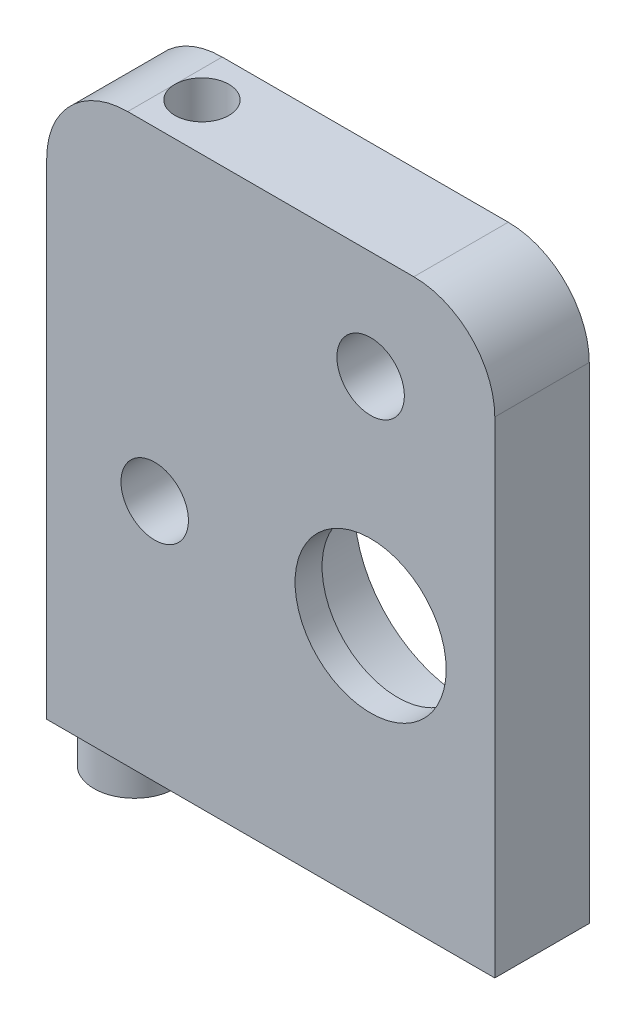
ISO-10303-21;
HEADER;
FILE_DESCRIPTION(('STEP AP214'),'2;1');
FILE_NAME('part.step','',(''),(''),'','','');
FILE_SCHEMA(('AUTOMOTIVE_DESIGN { 1 0 10303 214 1 1 1 1 }'));
ENDSEC;
DATA;
#1=APPLICATION_CONTEXT('core data for automotive mechanical design processes');
#2=APPLICATION_PROTOCOL_DEFINITION('international standard','automotive_design',2000,#1);
#3=PRODUCT_CONTEXT('',#1,'mechanical');
#4=PRODUCT('Part','Part','',(#3));
#5=PRODUCT_RELATED_PRODUCT_CATEGORY('part','',(#4));
#6=PRODUCT_DEFINITION_FORMATION('','',#4);
#7=PRODUCT_DEFINITION_CONTEXT('part definition',#1,'design');
#8=PRODUCT_DEFINITION('design','',#6,#7);
#9=PRODUCT_DEFINITION_SHAPE('','',#8);
#10=(LENGTH_UNIT() NAMED_UNIT(*) SI_UNIT(.MILLI.,.METRE.));
#11=(NAMED_UNIT(*) PLANE_ANGLE_UNIT() SI_UNIT($,.RADIAN.));
#12=(NAMED_UNIT(*) SI_UNIT($,.STERADIAN.) SOLID_ANGLE_UNIT());
#13=UNCERTAINTY_MEASURE_WITH_UNIT(LENGTH_MEASURE(1.E-05),#10,'distance_accuracy_value','');
#14=(GEOMETRIC_REPRESENTATION_CONTEXT(3) GLOBAL_UNCERTAINTY_ASSIGNED_CONTEXT((#13)) GLOBAL_UNIT_ASSIGNED_CONTEXT((#10,
#11,#12)) REPRESENTATION_CONTEXT('',''));
#15=CARTESIAN_POINT('',(0.,0.,0.));
#16=DIRECTION('',(0.,0.,1.));
#17=DIRECTION('',(1.,0.,0.));
#18=AXIS2_PLACEMENT_3D('',#15,#16,#17);
#19=CARTESIAN_POINT('',(0.,0.,3.5));
#20=DIRECTION('',(0.,0.,-1.));
#21=DIRECTION('',(-1.,0.,0.));
#22=AXIS2_PLACEMENT_3D('',#19,#20,#21);
#23=CYLINDRICAL_SURFACE('',#22,4.1);
#24=CARTESIAN_POINT('',(0.,0.,0.));
#25=DIRECTION('',(0.,0.,1.));
#26=DIRECTION('',(1.,0.,0.));
#27=AXIS2_PLACEMENT_3D('',#24,#25,#26);
#28=CIRCLE('',#27,4.1);
#29=CARTESIAN_POINT('',(4.1,0.,0.));
#30=VERTEX_POINT('',#29);
#31=EDGE_CURVE('E195',#30,#30,#28,.T.);
#32=ORIENTED_EDGE('',*,*,#31,.F.);
#33=EDGE_LOOP('',(#32));
#34=FACE_BOUND('',#33,.T.);
#35=CARTESIAN_POINT('',(0.,0.,2.5));
#36=DIRECTION('',(0.,0.,1.));
#37=DIRECTION('',(1.,0.,0.));
#38=AXIS2_PLACEMENT_3D('',#35,#36,#37);
#39=CIRCLE('',#38,4.1);
#40=CARTESIAN_POINT('',(4.1,0.,2.5));
#41=VERTEX_POINT('',#40);
#42=EDGE_CURVE('E207',#41,#41,#39,.T.);
#43=ORIENTED_EDGE('',*,*,#42,.T.);
#44=EDGE_LOOP('',(#43));
#45=FACE_BOUND('',#44,.T.);
#46=ADVANCED_FACE('F51',(#34,#45),#23,.F.);
#47=CARTESIAN_POINT('',(4.6,0.,3.5));
#48=DIRECTION('',(1.,0.,0.));
#49=DIRECTION('',(0.,1.,0.));
#50=AXIS2_PLACEMENT_3D('',#47,#48,#49);
#51=PLANE('',#50);
#52=DIRECTION('',(0.,-1.,0.));
#53=VECTOR('',#52,1.);
#54=CARTESIAN_POINT('',(4.6,0.,0.));
#55=LINE('',#54,#53);
#56=CARTESIAN_POINT('',(4.6,9.,0.));
#57=VERTEX_POINT('',#56);
#58=CARTESIAN_POINT('',(4.6,-9.,0.));
#59=VERTEX_POINT('',#58);
#60=EDGE_CURVE('E190',#57,#59,#55,.T.);
#61=ORIENTED_EDGE('',*,*,#60,.F.);
#62=DIRECTION('',(0.,0.,-1.));
#63=VECTOR('',#62,1.);
#64=CARTESIAN_POINT('',(4.6,9.,3.5));
#65=LINE('',#64,#63);
#66=CARTESIAN_POINT('',(4.6,9.,3.5));
#67=VERTEX_POINT('',#66);
#68=EDGE_CURVE('E60',#57,#67,#65,.F.);
#69=ORIENTED_EDGE('',*,*,#68,.T.);
#70=DIRECTION('',(0.,-1.,0.));
#71=VECTOR('',#70,1.);
#72=CARTESIAN_POINT('',(4.6,0.,3.5));
#73=LINE('',#72,#71);
#74=CARTESIAN_POINT('',(4.6,-9.,3.5));
#75=VERTEX_POINT('',#74);
#76=EDGE_CURVE('E175',#67,#75,#73,.T.);
#77=ORIENTED_EDGE('',*,*,#76,.T.);
#78=DIRECTION('',(0.,0.,-1.));
#79=VECTOR('',#78,1.);
#80=CARTESIAN_POINT('',(4.6,-9.,3.5));
#81=LINE('',#80,#79);
#82=EDGE_CURVE('E132',#75,#59,#81,.T.);
#83=ORIENTED_EDGE('',*,*,#82,.T.);
#84=EDGE_LOOP('',(#61,#69,#77,#83));
#85=FACE_BOUND('',#84,.T.);
#86=ADVANCED_FACE('F268',(#85),#51,.T.);
#87=CARTESIAN_POINT('',(0.,12.,3.5));
#88=DIRECTION('',(0.,1.,0.));
#89=DIRECTION('',(0.,0.,1.));
#90=AXIS2_PLACEMENT_3D('',#87,#88,#89);
#91=PLANE('',#90);
#92=DIRECTION('',(0.,0.,-1.));
#93=VECTOR('',#92,1.);
#94=CARTESIAN_POINT('',(-9.,12.,3.5));
#95=LINE('',#94,#93);
#96=CARTESIAN_POINT('',(-9.,12.,0.));
#97=VERTEX_POINT('',#96);
#98=CARTESIAN_POINT('',(-9.,12.,1.75));
#99=VERTEX_POINT('',#98);
#100=EDGE_CURVE('E144',#97,#99,#95,.F.);
#101=ORIENTED_EDGE('',*,*,#100,.T.);
#102=CARTESIAN_POINT('',(-8.,12.,1.75));
#103=DIRECTION('',(0.,1.,0.));
#104=DIRECTION('',(0.,0.,1.));
#105=AXIS2_PLACEMENT_3D('',#102,#103,#104);
#106=CIRCLE('',#105,1.);
#107=EDGE_CURVE('E65',#99,#99,#106,.T.);
#108=ORIENTED_EDGE('',*,*,#107,.F.);
#109=CARTESIAN_POINT('',(-9.,12.,3.5));
#110=VERTEX_POINT('',#109);
#111=EDGE_CURVE('E143',#99,#110,#95,.F.);
#112=ORIENTED_EDGE('',*,*,#111,.T.);
#113=DIRECTION('',(1.,0.,0.));
#114=VECTOR('',#113,1.);
#115=CARTESIAN_POINT('',(0.,12.,3.5));
#116=LINE('',#115,#114);
#117=CARTESIAN_POINT('',(1.6,12.,3.5));
#118=VERTEX_POINT('',#117);
#119=EDGE_CURVE('E164',#110,#118,#116,.T.);
#120=ORIENTED_EDGE('',*,*,#119,.T.);
#121=DIRECTION('',(0.,0.,-1.));
#122=VECTOR('',#121,1.);
#123=CARTESIAN_POINT('',(1.6,12.,3.5));
#124=LINE('',#123,#122);
#125=CARTESIAN_POINT('',(1.6,12.,0.));
#126=VERTEX_POINT('',#125);
#127=EDGE_CURVE('E151',#118,#126,#124,.T.);
#128=ORIENTED_EDGE('',*,*,#127,.T.);
#129=DIRECTION('',(1.,0.,0.));
#130=VECTOR('',#129,1.);
#131=CARTESIAN_POINT('',(0.,12.,0.));
#132=LINE('',#131,#130);
#133=EDGE_CURVE('E185',#97,#126,#132,.T.);
#134=ORIENTED_EDGE('',*,*,#133,.F.);
#135=EDGE_LOOP('',(#101,#108,#112,#120,#128,#134));
#136=FACE_BOUND('',#135,.T.);
#137=ADVANCED_FACE('F163',(#136),#91,.T.);
#138=CARTESIAN_POINT('',(-12.,0.,3.5));
#139=DIRECTION('',(1.,0.,0.));
#140=DIRECTION('',(0.,1.,0.));
#141=AXIS2_PLACEMENT_3D('',#138,#139,#140);
#142=PLANE('',#141);
#143=DIRECTION('',(0.,-1.,0.));
#144=VECTOR('',#143,1.);
#145=CARTESIAN_POINT('',(-12.,0.,3.5));
#146=LINE('',#145,#144);
#147=CARTESIAN_POINT('',(-12.,9.,3.5));
#148=VERTEX_POINT('',#147);
#149=CARTESIAN_POINT('',(-12.,-9.,3.5));
#150=VERTEX_POINT('',#149);
#151=EDGE_CURVE('E174',#148,#150,#146,.T.);
#152=ORIENTED_EDGE('',*,*,#151,.F.);
#153=DIRECTION('',(0.,0.,-1.));
#154=VECTOR('',#153,1.);
#155=CARTESIAN_POINT('',(-12.,9.,0.));
#156=LINE('',#155,#154);
#157=CARTESIAN_POINT('',(-12.,9.,0.));
#158=VERTEX_POINT('',#157);
#159=EDGE_CURVE('E121',#148,#158,#156,.T.);
#160=ORIENTED_EDGE('',*,*,#159,.T.);
#161=DIRECTION('',(0.,-1.,0.));
#162=VECTOR('',#161,1.);
#163=CARTESIAN_POINT('',(-12.,0.,0.));
#164=LINE('',#163,#162);
#165=CARTESIAN_POINT('',(-12.,-9.,0.));
#166=VERTEX_POINT('',#165);
#167=EDGE_CURVE('E128',#158,#166,#164,.T.);
#168=ORIENTED_EDGE('',*,*,#167,.T.);
#169=DIRECTION('',(0.,0.,-1.));
#170=VECTOR('',#169,1.);
#171=CARTESIAN_POINT('',(-12.,-9.,3.5));
#172=LINE('',#171,#170);
#173=CARTESIAN_POINT('',(-12.,-9.,1.75));
#174=VERTEX_POINT('',#173);
#175=EDGE_CURVE('E122',#174,#166,#172,.T.);
#176=ORIENTED_EDGE('',*,*,#175,.F.);
#177=EDGE_CURVE('E110',#150,#174,#172,.T.);
#178=ORIENTED_EDGE('',*,*,#177,.F.);
#179=EDGE_LOOP('',(#152,#160,#168,#176,#178));
#180=FACE_BOUND('',#179,.T.);
#181=ADVANCED_FACE('F125',(#180),#142,.F.);
#182=CARTESIAN_POINT('',(0.,8.,3.5));
#183=DIRECTION('',(0.,0.,-1.));
#184=DIRECTION('',(-1.,0.,0.));
#185=AXIS2_PLACEMENT_3D('',#182,#183,#184);
#186=CYLINDRICAL_SURFACE('',#185,1.25);
#187=CARTESIAN_POINT('',(0.,8.,3.5));
#188=DIRECTION('',(0.,0.,1.));
#189=DIRECTION('',(1.,0.,0.));
#190=AXIS2_PLACEMENT_3D('',#187,#188,#189);
#191=CIRCLE('',#190,1.25);
#192=CARTESIAN_POINT('',(1.25,8.,3.5));
#193=VERTEX_POINT('',#192);
#194=EDGE_CURVE('E214',#193,#193,#191,.T.);
#195=ORIENTED_EDGE('',*,*,#194,.T.);
#196=EDGE_LOOP('',(#195));
#197=FACE_BOUND('',#196,.T.);
#198=CARTESIAN_POINT('',(0.,8.,0.));
#199=DIRECTION('',(0.,0.,1.));
#200=DIRECTION('',(1.,0.,0.));
#201=AXIS2_PLACEMENT_3D('',#198,#199,#200);
#202=CIRCLE('',#201,1.25);
#203=CARTESIAN_POINT('',(1.25,8.,0.));
#204=VERTEX_POINT('',#203);
#205=EDGE_CURVE('E199',#204,#204,#202,.T.);
#206=ORIENTED_EDGE('',*,*,#205,.F.);
#207=EDGE_LOOP('',(#206));
#208=FACE_BOUND('',#207,.T.);
#209=ADVANCED_FACE('F279',(#197,#208),#186,.F.);
#210=CARTESIAN_POINT('',(-8.,0.,3.5));
#211=DIRECTION('',(0.,0.,-1.));
#212=DIRECTION('',(-1.,0.,0.));
#213=AXIS2_PLACEMENT_3D('',#210,#211,#212);
#214=CYLINDRICAL_SURFACE('',#213,1.25);
#215=CARTESIAN_POINT('',(-8.,0.,3.5));
#216=DIRECTION('',(0.,0.,1.));
#217=DIRECTION('',(1.,0.,0.));
#218=AXIS2_PLACEMENT_3D('',#215,#216,#217);
#219=CIRCLE('',#218,1.25);
#220=CARTESIAN_POINT('',(-6.75,0.,3.5));
#221=VERTEX_POINT('',#220);
#222=EDGE_CURVE('E189',#221,#221,#219,.T.);
#223=ORIENTED_EDGE('',*,*,#222,.T.);
#224=EDGE_LOOP('',(#223));
#225=FACE_BOUND('',#224,.T.);
#226=CARTESIAN_POINT('',(-8.,0.,0.));
#227=DIRECTION('',(0.,0.,1.));
#228=DIRECTION('',(1.,0.,0.));
#229=AXIS2_PLACEMENT_3D('',#226,#227,#228);
#230=CIRCLE('',#229,1.25);
#231=CARTESIAN_POINT('',(-6.75,0.,0.));
#232=VERTEX_POINT('',#231);
#233=EDGE_CURVE('E203',#232,#232,#230,.T.);
#234=ORIENTED_EDGE('',*,*,#233,.F.);
#235=EDGE_LOOP('',(#234));
#236=FACE_BOUND('',#235,.T.);
#237=ADVANCED_FACE('F282',(#225,#236),#214,.F.);
#238=CARTESIAN_POINT('',(0.,-9.,3.5));
#239=DIRECTION('',(0.,1.,0.));
#240=DIRECTION('',(0.,0.,1.));
#241=AXIS2_PLACEMENT_3D('',#238,#239,#240);
#242=PLANE('',#241);
#243=CARTESIAN_POINT('',(-4.5,-9.,1.75));
#244=DIRECTION('',(0.,-1.,0.));
#245=DIRECTION('',(0.,0.,-1.));
#246=AXIS2_PLACEMENT_3D('',#243,#244,#245);
#247=CIRCLE('',#246,1.);
#248=CARTESIAN_POINT('',(-4.5,-9.,0.75));
#249=VERTEX_POINT('',#248);
#250=EDGE_CURVE('E233',#249,#249,#247,.T.);
#251=ORIENTED_EDGE('',*,*,#250,.F.);
#252=EDGE_LOOP('',(#251));
#253=FACE_BOUND('',#252,.T.);
#254=ORIENTED_EDGE('',*,*,#177,.T.);
#255=CARTESIAN_POINT('',(-10.5,-9.,1.75));
#256=DIRECTION('',(0.,-1.,0.));
#257=DIRECTION('',(0.,0.,-1.));
#258=AXIS2_PLACEMENT_3D('',#255,#256,#257);
#259=CIRCLE('',#258,1.5);
#260=EDGE_CURVE('E114',#174,#174,#259,.T.);
#261=ORIENTED_EDGE('',*,*,#260,.F.);
#262=ORIENTED_EDGE('',*,*,#175,.T.);
#263=DIRECTION('',(1.,0.,0.));
#264=VECTOR('',#263,1.);
#265=CARTESIAN_POINT('',(0.,-9.,0.));
#266=LINE('',#265,#264);
#267=EDGE_CURVE('E183',#166,#59,#266,.T.);
#268=ORIENTED_EDGE('',*,*,#267,.T.);
#269=ORIENTED_EDGE('',*,*,#82,.F.);
#270=DIRECTION('',(1.,0.,0.));
#271=VECTOR('',#270,1.);
#272=CARTESIAN_POINT('',(0.,-9.,3.5));
#273=LINE('',#272,#271);
#274=EDGE_CURVE('E117',#150,#75,#273,.T.);
#275=ORIENTED_EDGE('',*,*,#274,.F.);
#276=EDGE_LOOP('',(#254,#261,#262,#268,#269,#275));
#277=FACE_BOUND('',#276,.T.);
#278=ADVANCED_FACE('F112',(#253,#277),#242,.F.);
#279=CARTESIAN_POINT('',(0.,0.,3.5));
#280=DIRECTION('',(0.,0.,1.));
#281=DIRECTION('',(1.,0.,0.));
#282=AXIS2_PLACEMENT_3D('',#279,#280,#281);
#283=PLANE('',#282);
#284=ORIENTED_EDGE('',*,*,#222,.F.);
#285=EDGE_LOOP('',(#284));
#286=FACE_BOUND('',#285,.T.);
#287=ORIENTED_EDGE('',*,*,#194,.F.);
#288=EDGE_LOOP('',(#287));
#289=FACE_BOUND('',#288,.T.);
#290=ORIENTED_EDGE('',*,*,#76,.F.);
#291=CARTESIAN_POINT('',(1.6,9.,3.5));
#292=DIRECTION('',(0.,0.,1.));
#293=DIRECTION('',(1.,0.,0.));
#294=AXIS2_PLACEMENT_3D('',#291,#292,#293);
#295=CIRCLE('',#294,3.);
#296=EDGE_CURVE('E12',#67,#118,#295,.T.);
#297=ORIENTED_EDGE('',*,*,#296,.T.);
#298=ORIENTED_EDGE('',*,*,#119,.F.);
#299=CARTESIAN_POINT('',(-9.,9.,3.5));
#300=DIRECTION('',(0.,0.,1.));
#301=DIRECTION('',(1.,0.,0.));
#302=AXIS2_PLACEMENT_3D('',#299,#300,#301);
#303=CIRCLE('',#302,3.);
#304=EDGE_CURVE('E148',#110,#148,#303,.T.);
#305=ORIENTED_EDGE('',*,*,#304,.T.);
#306=ORIENTED_EDGE('',*,*,#151,.T.);
#307=ORIENTED_EDGE('',*,*,#274,.T.);
#308=EDGE_LOOP('',(#290,#297,#298,#305,#306,#307));
#309=FACE_BOUND('',#308,.T.);
#310=CARTESIAN_POINT('',(0.,0.,3.5));
#311=DIRECTION('',(0.,0.,1.));
#312=DIRECTION('',(1.,0.,0.));
#313=AXIS2_PLACEMENT_3D('',#310,#311,#312);
#314=CIRCLE('',#313,2.8);
#315=CARTESIAN_POINT('',(2.8,0.,3.5));
#316=VERTEX_POINT('',#315);
#317=EDGE_CURVE('E225',#316,#316,#314,.T.);
#318=ORIENTED_EDGE('',*,*,#317,.F.);
#319=EDGE_LOOP('',(#318));
#320=FACE_BOUND('',#319,.T.);
#321=ADVANCED_FACE('F170',(#286,#289,#309,#320),#283,.T.);
#322=CARTESIAN_POINT('',(0.,0.,0.));
#323=DIRECTION('',(0.,0.,1.));
#324=DIRECTION('',(1.,0.,0.));
#325=AXIS2_PLACEMENT_3D('',#322,#323,#324);
#326=PLANE('',#325);
#327=ORIENTED_EDGE('',*,*,#233,.T.);
#328=EDGE_LOOP('',(#327));
#329=FACE_BOUND('',#328,.T.);
#330=ORIENTED_EDGE('',*,*,#205,.T.);
#331=EDGE_LOOP('',(#330));
#332=FACE_BOUND('',#331,.T.);
#333=ORIENTED_EDGE('',*,*,#31,.T.);
#334=EDGE_LOOP('',(#333));
#335=FACE_BOUND('',#334,.T.);
#336=ORIENTED_EDGE('',*,*,#133,.T.);
#337=CARTESIAN_POINT('',(1.6,9.,0.));
#338=DIRECTION('',(0.,0.,1.));
#339=DIRECTION('',(1.,0.,0.));
#340=AXIS2_PLACEMENT_3D('',#337,#338,#339);
#341=CIRCLE('',#340,3.);
#342=EDGE_CURVE('E155',#126,#57,#341,.F.);
#343=ORIENTED_EDGE('',*,*,#342,.T.);
#344=ORIENTED_EDGE('',*,*,#60,.T.);
#345=ORIENTED_EDGE('',*,*,#267,.F.);
#346=ORIENTED_EDGE('',*,*,#167,.F.);
#347=CARTESIAN_POINT('',(-9.,9.,0.));
#348=DIRECTION('',(0.,0.,1.));
#349=DIRECTION('',(1.,0.,0.));
#350=AXIS2_PLACEMENT_3D('',#347,#348,#349);
#351=CIRCLE('',#350,3.);
#352=EDGE_CURVE('E140',#158,#97,#351,.F.);
#353=ORIENTED_EDGE('',*,*,#352,.T.);
#354=EDGE_LOOP('',(#336,#343,#344,#345,#346,#353));
#355=FACE_BOUND('',#354,.T.);
#356=ADVANCED_FACE('F181',(#329,#332,#335,#355),#326,.F.);
#357=CARTESIAN_POINT('',(0.,0.,2.5));
#358=DIRECTION('',(0.,0.,1.));
#359=DIRECTION('',(1.,0.,0.));
#360=AXIS2_PLACEMENT_3D('',#357,#358,#359);
#361=PLANE('',#360);
#362=CARTESIAN_POINT('',(0.,0.,2.5));
#363=DIRECTION('',(0.,0.,1.));
#364=DIRECTION('',(1.,0.,0.));
#365=AXIS2_PLACEMENT_3D('',#362,#363,#364);
#366=CIRCLE('',#365,2.8);
#367=CARTESIAN_POINT('',(2.8,0.,2.5));
#368=VERTEX_POINT('',#367);
#369=EDGE_CURVE('E224',#368,#368,#366,.T.);
#370=ORIENTED_EDGE('',*,*,#369,.T.);
#371=EDGE_LOOP('',(#370));
#372=FACE_BOUND('',#371,.T.);
#373=ORIENTED_EDGE('',*,*,#42,.F.);
#374=EDGE_LOOP('',(#373));
#375=FACE_BOUND('',#374,.T.);
#376=ADVANCED_FACE('F294',(#372,#375),#361,.F.);
#377=CARTESIAN_POINT('',(0.,0.,2.5));
#378=DIRECTION('',(0.,0.,1.));
#379=DIRECTION('',(1.,0.,0.));
#380=AXIS2_PLACEMENT_3D('',#377,#378,#379);
#381=CYLINDRICAL_SURFACE('',#380,2.8);
#382=ORIENTED_EDGE('',*,*,#369,.F.);
#383=EDGE_LOOP('',(#382));
#384=FACE_BOUND('',#383,.T.);
#385=ORIENTED_EDGE('',*,*,#317,.T.);
#386=EDGE_LOOP('',(#385));
#387=FACE_BOUND('',#386,.T.);
#388=ADVANCED_FACE('F287',(#384,#387),#381,.F.);
#389=CARTESIAN_POINT('',(-9.,9.,3.5));
#390=DIRECTION('',(0.,0.,1.));
#391=DIRECTION('',(1.,0.,0.));
#392=AXIS2_PLACEMENT_3D('',#389,#390,#391);
#393=CYLINDRICAL_SURFACE('',#392,3.);
#394=ORIENTED_EDGE('',*,*,#304,.F.);
#395=ORIENTED_EDGE('',*,*,#111,.F.);
#396=ORIENTED_EDGE('',*,*,#100,.F.);
#397=ORIENTED_EDGE('',*,*,#352,.F.);
#398=ORIENTED_EDGE('',*,*,#159,.F.);
#399=EDGE_LOOP('',(#394,#395,#396,#397,#398));
#400=FACE_BOUND('',#399,.T.);
#401=ADVANCED_FACE('F178',(#400),#393,.T.);
#402=CARTESIAN_POINT('',(1.6,9.,3.5));
#403=DIRECTION('',(0.,0.,-1.));
#404=DIRECTION('',(-1.,0.,0.));
#405=AXIS2_PLACEMENT_3D('',#402,#403,#404);
#406=CYLINDRICAL_SURFACE('',#405,3.);
#407=ORIENTED_EDGE('',*,*,#296,.F.);
#408=ORIENTED_EDGE('',*,*,#68,.F.);
#409=ORIENTED_EDGE('',*,*,#342,.F.);
#410=ORIENTED_EDGE('',*,*,#127,.F.);
#411=EDGE_LOOP('',(#407,#408,#409,#410));
#412=FACE_BOUND('',#411,.T.);
#413=ADVANCED_FACE('F53',(#412),#406,.T.);
#414=CARTESIAN_POINT('',(-4.5,-3.,1.75));
#415=DIRECTION('',(0.,-1.,0.));
#416=DIRECTION('',(0.,0.,-1.));
#417=AXIS2_PLACEMENT_3D('',#414,#415,#416);
#418=CYLINDRICAL_SURFACE('',#417,1.);
#419=CARTESIAN_POINT('',(-4.5,-3.,1.75));
#420=DIRECTION('',(0.,-1.,0.));
#421=DIRECTION('',(0.,0.,-1.));
#422=AXIS2_PLACEMENT_3D('',#419,#420,#421);
#423=CIRCLE('',#422,1.);
#424=CARTESIAN_POINT('',(-4.5,-3.,0.75));
#425=VERTEX_POINT('',#424);
#426=EDGE_CURVE('E229',#425,#425,#423,.T.);
#427=ORIENTED_EDGE('',*,*,#426,.F.);
#428=EDGE_LOOP('',(#427));
#429=FACE_BOUND('',#428,.T.);
#430=ORIENTED_EDGE('',*,*,#250,.T.);
#431=EDGE_LOOP('',(#430));
#432=FACE_BOUND('',#431,.T.);
#433=ADVANCED_FACE('F292',(#429,#432),#418,.F.);
#434=CARTESIAN_POINT('',(0.,-3.,0.));
#435=DIRECTION('',(0.,-1.,0.));
#436=DIRECTION('',(0.,0.,-1.));
#437=AXIS2_PLACEMENT_3D('',#434,#435,#436);
#438=PLANE('',#437);
#439=ORIENTED_EDGE('',*,*,#426,.T.);
#440=EDGE_LOOP('',(#439));
#441=FACE_BOUND('',#440,.T.);
#442=ADVANCED_FACE('F424',(#441),#438,.T.);
#443=CARTESIAN_POINT('',(-10.5,-10.6,1.75));
#444=DIRECTION('',(0.,1.,0.));
#445=DIRECTION('',(0.,0.,1.));
#446=AXIS2_PLACEMENT_3D('',#443,#444,#445);
#447=CYLINDRICAL_SURFACE('',#446,1.5);
#448=CARTESIAN_POINT('',(-10.5,-10.6,1.75));
#449=DIRECTION('',(0.,-1.,0.));
#450=DIRECTION('',(0.,0.,-1.));
#451=AXIS2_PLACEMENT_3D('',#448,#449,#450);
#452=CIRCLE('',#451,1.5);
#453=CARTESIAN_POINT('',(-10.5,-10.6,0.249999999999999));
#454=VERTEX_POINT('',#453);
#455=EDGE_CURVE('E237',#454,#454,#452,.T.);
#456=ORIENTED_EDGE('',*,*,#455,.F.);
#457=EDGE_LOOP('',(#456));
#458=FACE_BOUND('',#457,.T.);
#459=ORIENTED_EDGE('',*,*,#260,.T.);
#460=EDGE_LOOP('',(#459));
#461=FACE_BOUND('',#460,.T.);
#462=ADVANCED_FACE('F264',(#458,#461),#447,.T.);
#463=CARTESIAN_POINT('',(0.,-10.6,0.));
#464=DIRECTION('',(0.,-1.,0.));
#465=DIRECTION('',(0.,0.,-1.));
#466=AXIS2_PLACEMENT_3D('',#463,#464,#465);
#467=PLANE('',#466);
#468=ORIENTED_EDGE('',*,*,#455,.T.);
#469=EDGE_LOOP('',(#468));
#470=FACE_BOUND('',#469,.T.);
#471=ADVANCED_FACE('F257',(#470),#467,.T.);
#472=CARTESIAN_POINT('',(-8.,6.,1.75));
#473=DIRECTION('',(0.,1.,0.));
#474=DIRECTION('',(0.,0.,1.));
#475=AXIS2_PLACEMENT_3D('',#472,#473,#474);
#476=CYLINDRICAL_SURFACE('',#475,1.);
#477=CARTESIAN_POINT('',(-8.,6.,1.75));
#478=DIRECTION('',(0.,1.,0.));
#479=DIRECTION('',(0.,0.,1.));
#480=AXIS2_PLACEMENT_3D('',#477,#478,#479);
#481=CIRCLE('',#480,1.);
#482=CARTESIAN_POINT('',(-8.,6.,2.75));
#483=VERTEX_POINT('',#482);
#484=EDGE_CURVE('E243',#483,#483,#481,.T.);
#485=ORIENTED_EDGE('',*,*,#484,.F.);
#486=EDGE_LOOP('',(#485));
#487=FACE_BOUND('',#486,.T.);
#488=ORIENTED_EDGE('',*,*,#107,.T.);
#489=EDGE_LOOP('',(#488));
#490=FACE_BOUND('',#489,.T.);
#491=ADVANCED_FACE('F255',(#487,#490),#476,.F.);
#492=CARTESIAN_POINT('',(-8.,6.,1.75));
#493=DIRECTION('',(0.,1.,0.));
#494=DIRECTION('',(0.,0.,1.));
#495=AXIS2_PLACEMENT_3D('',#492,#493,#494);
#496=PLANE('',#495);
#497=ORIENTED_EDGE('',*,*,#484,.T.);
#498=EDGE_LOOP('',(#497));
#499=FACE_BOUND('',#498,.T.);
#500=ADVANCED_FACE('F253',(#499),#496,.T.);
#501=CLOSED_SHELL('',(#46,#86,#137,#181,#209,#237,#278,#321,#356,#376,#388,#401,#413,#433,#442,
#462,#471,#491,#500));
#502=MANIFOLD_SOLID_BREP('B2',#501);
#503=ADVANCED_BREP_SHAPE_REPRESENTATION('',(#18,#502),#14);
#504=SHAPE_DEFINITION_REPRESENTATION(#9,#503);
ENDSEC;
END-ISO-10303-21;
